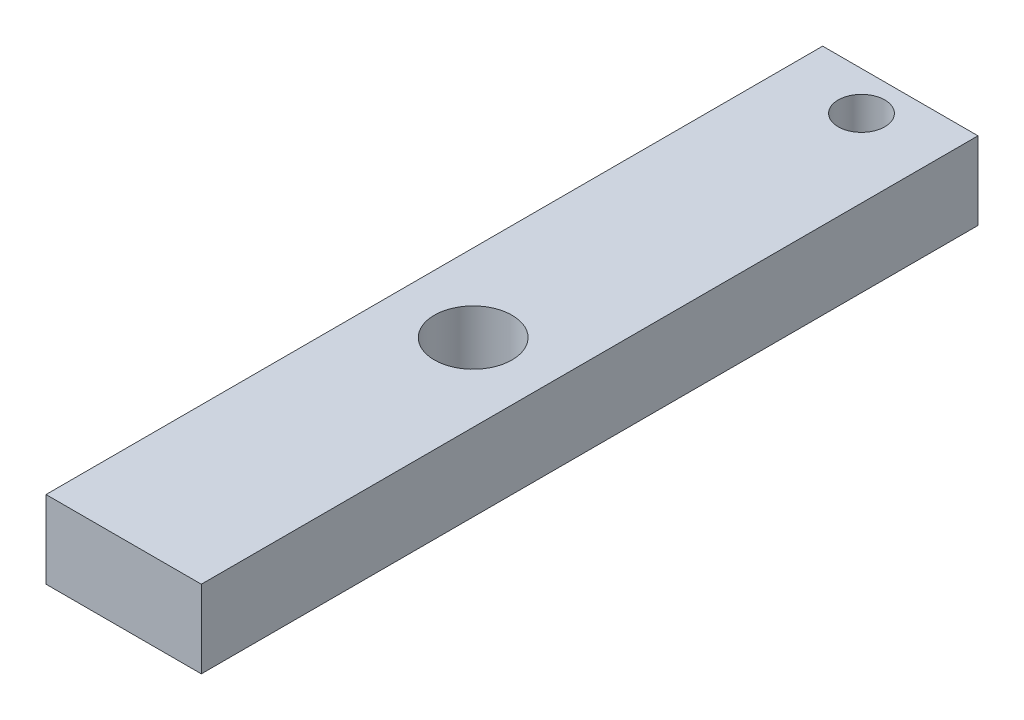
ISO-10303-21;
HEADER;
FILE_DESCRIPTION(('STEP AP214'),'2;1');
FILE_NAME('part.step','',(''),(''),'','','');
FILE_SCHEMA(('AUTOMOTIVE_DESIGN { 1 0 10303 214 1 1 1 1 }'));
ENDSEC;
DATA;
#1=APPLICATION_CONTEXT('core data for automotive mechanical design processes');
#2=APPLICATION_PROTOCOL_DEFINITION('international standard','automotive_design',2000,#1);
#3=PRODUCT_CONTEXT('',#1,'mechanical');
#4=PRODUCT('Part','Part','',(#3));
#5=PRODUCT_RELATED_PRODUCT_CATEGORY('part','',(#4));
#6=PRODUCT_DEFINITION_FORMATION('','',#4);
#7=PRODUCT_DEFINITION_CONTEXT('part definition',#1,'design');
#8=PRODUCT_DEFINITION('design','',#6,#7);
#9=PRODUCT_DEFINITION_SHAPE('','',#8);
#10=(LENGTH_UNIT() NAMED_UNIT(*) SI_UNIT(.MILLI.,.METRE.));
#11=(NAMED_UNIT(*) PLANE_ANGLE_UNIT() SI_UNIT($,.RADIAN.));
#12=(NAMED_UNIT(*) SI_UNIT($,.STERADIAN.) SOLID_ANGLE_UNIT());
#13=UNCERTAINTY_MEASURE_WITH_UNIT(LENGTH_MEASURE(1.E-05),#10,'distance_accuracy_value','');
#14=(GEOMETRIC_REPRESENTATION_CONTEXT(3) GLOBAL_UNCERTAINTY_ASSIGNED_CONTEXT((#13)) GLOBAL_UNIT_ASSIGNED_CONTEXT((#10,
#11,#12)) REPRESENTATION_CONTEXT('',''));
#15=CARTESIAN_POINT('',(0.,0.,0.));
#16=DIRECTION('',(0.,0.,1.));
#17=DIRECTION('',(1.,0.,0.));
#18=AXIS2_PLACEMENT_3D('',#15,#16,#17);
#19=CARTESIAN_POINT('',(0.,10.,0.));
#20=DIRECTION('',(0.,-1.,0.));
#21=DIRECTION('',(0.,0.,-1.));
#22=AXIS2_PLACEMENT_3D('',#19,#20,#21);
#23=PLANE('',#22);
#24=DIRECTION('',(0.,0.,-1.));
#25=VECTOR('',#24,1.);
#26=CARTESIAN_POINT('',(10.,10.,50.));
#27=LINE('',#26,#25);
#28=CARTESIAN_POINT('',(10.,10.,50.));
#29=VERTEX_POINT('',#28);
#30=CARTESIAN_POINT('',(10.,10.,-50.));
#31=VERTEX_POINT('',#30);
#32=EDGE_CURVE('E89',#29,#31,#27,.T.);
#33=ORIENTED_EDGE('',*,*,#32,.T.);
#34=DIRECTION('',(-1.,0.,0.));
#35=VECTOR('',#34,1.);
#36=CARTESIAN_POINT('',(-10.,10.,-50.));
#37=LINE('',#36,#35);
#38=CARTESIAN_POINT('',(-10.,10.,-50.));
#39=VERTEX_POINT('',#38);
#40=EDGE_CURVE('E84',#31,#39,#37,.T.);
#41=ORIENTED_EDGE('',*,*,#40,.T.);
#42=DIRECTION('',(0.,0.,1.));
#43=VECTOR('',#42,1.);
#44=CARTESIAN_POINT('',(-10.,10.,50.));
#45=LINE('',#44,#43);
#46=CARTESIAN_POINT('',(-10.,10.,50.));
#47=VERTEX_POINT('',#46);
#48=EDGE_CURVE('E87',#39,#47,#45,.T.);
#49=ORIENTED_EDGE('',*,*,#48,.T.);
#50=DIRECTION('',(1.,0.,0.));
#51=VECTOR('',#50,1.);
#52=CARTESIAN_POINT('',(-10.,10.,50.));
#53=LINE('',#52,#51);
#54=EDGE_CURVE('E54',#47,#29,#53,.T.);
#55=ORIENTED_EDGE('',*,*,#54,.T.);
#56=EDGE_LOOP('',(#33,#41,#49,#55));
#57=FACE_BOUND('',#56,.T.);
#58=CARTESIAN_POINT('',(0.,10.,4.99999999999999));
#59=DIRECTION('',(0.,1.,0.));
#60=DIRECTION('',(0.,0.,1.));
#61=AXIS2_PLACEMENT_3D('',#58,#59,#60);
#62=CIRCLE('',#61,5.);
#63=CARTESIAN_POINT('',(0.,10.,9.99999999999999));
#64=VERTEX_POINT('',#63);
#65=EDGE_CURVE('E104',#64,#64,#62,.T.);
#66=ORIENTED_EDGE('',*,*,#65,.F.);
#67=EDGE_LOOP('',(#66));
#68=FACE_BOUND('',#67,.T.);
#69=CARTESIAN_POINT('',(0.,10.,-45.));
#70=DIRECTION('',(0.,1.,0.));
#71=DIRECTION('',(0.,0.,1.));
#72=AXIS2_PLACEMENT_3D('',#69,#70,#71);
#73=CIRCLE('',#72,3.);
#74=CARTESIAN_POINT('',(0.,10.,-42.));
#75=VERTEX_POINT('',#74);
#76=EDGE_CURVE('E119',#75,#75,#73,.T.);
#77=ORIENTED_EDGE('',*,*,#76,.F.);
#78=EDGE_LOOP('',(#77));
#79=FACE_BOUND('',#78,.T.);
#80=ADVANCED_FACE('F37',(#57,#68,#79),#23,.F.);
#81=CARTESIAN_POINT('',(0.,0.,0.));
#82=DIRECTION('',(0.,-1.,0.));
#83=DIRECTION('',(0.,0.,-1.));
#84=AXIS2_PLACEMENT_3D('',#81,#82,#83);
#85=PLANE('',#84);
#86=CARTESIAN_POINT('',(0.,0.,4.99999999999999));
#87=DIRECTION('',(0.,1.,0.));
#88=DIRECTION('',(0.,0.,1.));
#89=AXIS2_PLACEMENT_3D('',#86,#87,#88);
#90=CIRCLE('',#89,5.);
#91=CARTESIAN_POINT('',(0.,0.,9.99999999999999));
#92=VERTEX_POINT('',#91);
#93=EDGE_CURVE('E116',#92,#92,#90,.T.);
#94=ORIENTED_EDGE('',*,*,#93,.T.);
#95=EDGE_LOOP('',(#94));
#96=FACE_BOUND('',#95,.T.);
#97=DIRECTION('',(0.,0.,-1.));
#98=VECTOR('',#97,1.);
#99=CARTESIAN_POINT('',(10.,0.,50.));
#100=LINE('',#99,#98);
#101=CARTESIAN_POINT('',(10.,0.,50.));
#102=VERTEX_POINT('',#101);
#103=CARTESIAN_POINT('',(10.,0.,-50.));
#104=VERTEX_POINT('',#103);
#105=EDGE_CURVE('E101',#102,#104,#100,.T.);
#106=ORIENTED_EDGE('',*,*,#105,.F.);
#107=DIRECTION('',(1.,0.,0.));
#108=VECTOR('',#107,1.);
#109=CARTESIAN_POINT('',(-10.,0.,50.));
#110=LINE('',#109,#108);
#111=CARTESIAN_POINT('',(-10.,0.,50.));
#112=VERTEX_POINT('',#111);
#113=EDGE_CURVE('E77',#112,#102,#110,.T.);
#114=ORIENTED_EDGE('',*,*,#113,.F.);
#115=DIRECTION('',(0.,0.,1.));
#116=VECTOR('',#115,1.);
#117=CARTESIAN_POINT('',(-10.,0.,50.));
#118=LINE('',#117,#116);
#119=CARTESIAN_POINT('',(-10.,0.,-50.));
#120=VERTEX_POINT('',#119);
#121=EDGE_CURVE('E71',#120,#112,#118,.T.);
#122=ORIENTED_EDGE('',*,*,#121,.F.);
#123=DIRECTION('',(-1.,0.,0.));
#124=VECTOR('',#123,1.);
#125=CARTESIAN_POINT('',(-10.,0.,-50.));
#126=LINE('',#125,#124);
#127=EDGE_CURVE('E93',#104,#120,#126,.T.);
#128=ORIENTED_EDGE('',*,*,#127,.F.);
#129=EDGE_LOOP('',(#106,#114,#122,#128));
#130=FACE_BOUND('',#129,.T.);
#131=CARTESIAN_POINT('',(0.,0.,-45.));
#132=DIRECTION('',(0.,1.,0.));
#133=DIRECTION('',(0.,0.,1.));
#134=AXIS2_PLACEMENT_3D('',#131,#132,#133);
#135=CIRCLE('',#134,3.);
#136=CARTESIAN_POINT('',(0.,0.,-42.));
#137=VERTEX_POINT('',#136);
#138=EDGE_CURVE('E122',#137,#137,#135,.T.);
#139=ORIENTED_EDGE('',*,*,#138,.T.);
#140=EDGE_LOOP('',(#139));
#141=FACE_BOUND('',#140,.T.);
#142=ADVANCED_FACE('F112',(#96,#130,#141),#85,.T.);
#143=CARTESIAN_POINT('',(10.,10.,50.));
#144=DIRECTION('',(-1.,0.,0.));
#145=DIRECTION('',(0.,0.,1.));
#146=AXIS2_PLACEMENT_3D('',#143,#144,#145);
#147=PLANE('',#146);
#148=ORIENTED_EDGE('',*,*,#105,.T.);
#149=DIRECTION('',(0.,-1.,0.));
#150=VECTOR('',#149,1.);
#151=CARTESIAN_POINT('',(10.,10.,-50.));
#152=LINE('',#151,#150);
#153=EDGE_CURVE('E11',#31,#104,#152,.T.);
#154=ORIENTED_EDGE('',*,*,#153,.F.);
#155=ORIENTED_EDGE('',*,*,#32,.F.);
#156=DIRECTION('',(0.,-1.,0.));
#157=VECTOR('',#156,1.);
#158=CARTESIAN_POINT('',(10.,10.,50.));
#159=LINE('',#158,#157);
#160=EDGE_CURVE('E97',#29,#102,#159,.T.);
#161=ORIENTED_EDGE('',*,*,#160,.T.);
#162=EDGE_LOOP('',(#148,#154,#155,#161));
#163=FACE_BOUND('',#162,.T.);
#164=ADVANCED_FACE('F39',(#163),#147,.F.);
#165=CARTESIAN_POINT('',(-10.,10.,-50.));
#166=DIRECTION('',(0.,0.,1.));
#167=DIRECTION('',(1.,0.,0.));
#168=AXIS2_PLACEMENT_3D('',#165,#166,#167);
#169=PLANE('',#168);
#170=ORIENTED_EDGE('',*,*,#127,.T.);
#171=DIRECTION('',(0.,-1.,0.));
#172=VECTOR('',#171,1.);
#173=CARTESIAN_POINT('',(-10.,10.,-50.));
#174=LINE('',#173,#172);
#175=EDGE_CURVE('E46',#39,#120,#174,.T.);
#176=ORIENTED_EDGE('',*,*,#175,.F.);
#177=ORIENTED_EDGE('',*,*,#40,.F.);
#178=ORIENTED_EDGE('',*,*,#153,.T.);
#179=EDGE_LOOP('',(#170,#176,#177,#178));
#180=FACE_BOUND('',#179,.T.);
#181=ADVANCED_FACE('F92',(#180),#169,.F.);
#182=CARTESIAN_POINT('',(-10.,10.,50.));
#183=DIRECTION('',(1.,0.,0.));
#184=DIRECTION('',(0.,0.,-1.));
#185=AXIS2_PLACEMENT_3D('',#182,#183,#184);
#186=PLANE('',#185);
#187=ORIENTED_EDGE('',*,*,#121,.T.);
#188=DIRECTION('',(0.,-1.,0.));
#189=VECTOR('',#188,1.);
#190=CARTESIAN_POINT('',(-10.,10.,50.));
#191=LINE('',#190,#189);
#192=EDGE_CURVE('E94',#47,#112,#191,.T.);
#193=ORIENTED_EDGE('',*,*,#192,.F.);
#194=ORIENTED_EDGE('',*,*,#48,.F.);
#195=ORIENTED_EDGE('',*,*,#175,.T.);
#196=EDGE_LOOP('',(#187,#193,#194,#195));
#197=FACE_BOUND('',#196,.T.);
#198=ADVANCED_FACE('F95',(#197),#186,.F.);
#199=CARTESIAN_POINT('',(-10.,10.,50.));
#200=DIRECTION('',(0.,0.,-1.));
#201=DIRECTION('',(-1.,0.,0.));
#202=AXIS2_PLACEMENT_3D('',#199,#200,#201);
#203=PLANE('',#202);
#204=ORIENTED_EDGE('',*,*,#113,.T.);
#205=ORIENTED_EDGE('',*,*,#160,.F.);
#206=ORIENTED_EDGE('',*,*,#54,.F.);
#207=ORIENTED_EDGE('',*,*,#192,.T.);
#208=EDGE_LOOP('',(#204,#205,#206,#207));
#209=FACE_BOUND('',#208,.T.);
#210=ADVANCED_FACE('F109',(#209),#203,.F.);
#211=CARTESIAN_POINT('',(0.,10.,4.99999999999999));
#212=DIRECTION('',(0.,-1.,0.));
#213=DIRECTION('',(0.,0.,-1.));
#214=AXIS2_PLACEMENT_3D('',#211,#212,#213);
#215=CYLINDRICAL_SURFACE('',#214,5.);
#216=ORIENTED_EDGE('',*,*,#65,.T.);
#217=EDGE_LOOP('',(#216));
#218=FACE_BOUND('',#217,.T.);
#219=ORIENTED_EDGE('',*,*,#93,.F.);
#220=EDGE_LOOP('',(#219));
#221=FACE_BOUND('',#220,.T.);
#222=ADVANCED_FACE('F139',(#218,#221),#215,.F.);
#223=CARTESIAN_POINT('',(0.,10.,-45.));
#224=DIRECTION('',(0.,-1.,0.));
#225=DIRECTION('',(0.,0.,-1.));
#226=AXIS2_PLACEMENT_3D('',#223,#224,#225);
#227=CYLINDRICAL_SURFACE('',#226,3.);
#228=ORIENTED_EDGE('',*,*,#76,.T.);
#229=EDGE_LOOP('',(#228));
#230=FACE_BOUND('',#229,.T.);
#231=ORIENTED_EDGE('',*,*,#138,.F.);
#232=EDGE_LOOP('',(#231));
#233=FACE_BOUND('',#232,.T.);
#234=ADVANCED_FACE('F128',(#230,#233),#227,.F.);
#235=CLOSED_SHELL('',(#80,#142,#164,#181,#198,#210,#222,#234));
#236=MANIFOLD_SOLID_BREP('B2',#235);
#237=ADVANCED_BREP_SHAPE_REPRESENTATION('',(#18,#236),#14);
#238=SHAPE_DEFINITION_REPRESENTATION(#9,#237);
ENDSEC;
END-ISO-10303-21;
